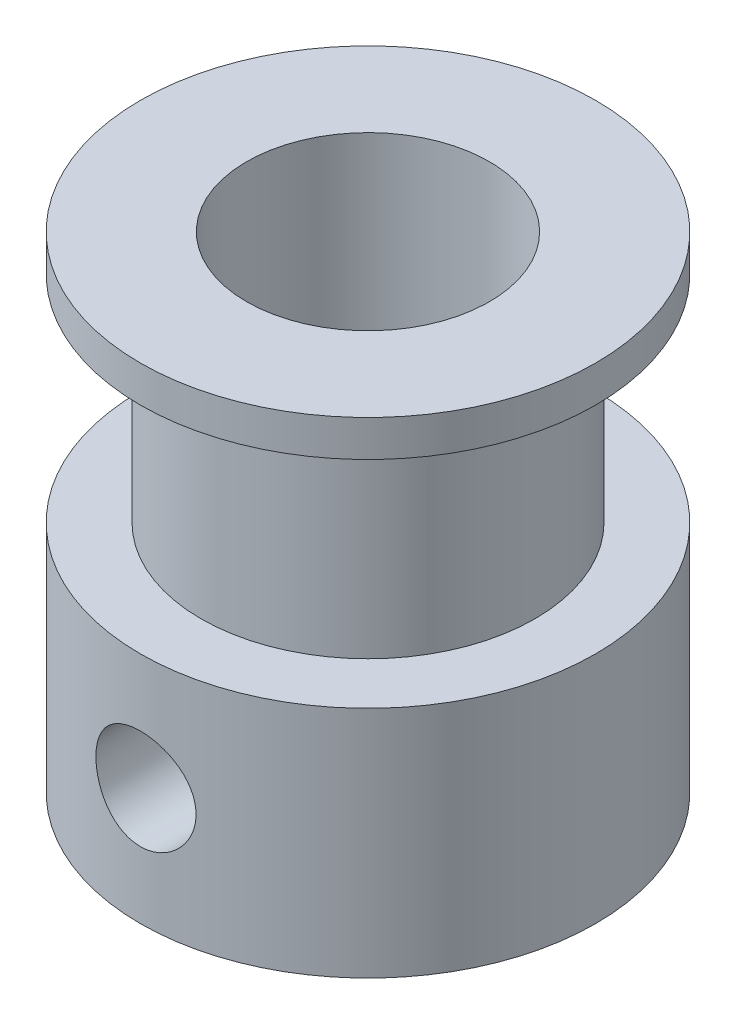
ISO-10303-21;
HEADER;
FILE_DESCRIPTION(('STEP AP214'),'2;1');
FILE_NAME('part.step','',(''),(''),'','','');
FILE_SCHEMA(('AUTOMOTIVE_DESIGN { 1 0 10303 214 1 1 1 1 }'));
ENDSEC;
DATA;
#1=APPLICATION_CONTEXT('core data for automotive mechanical design processes');
#2=APPLICATION_PROTOCOL_DEFINITION('international standard','automotive_design',2000,#1);
#3=PRODUCT_CONTEXT('',#1,'mechanical');
#4=PRODUCT('Part','Part','',(#3));
#5=PRODUCT_RELATED_PRODUCT_CATEGORY('part','',(#4));
#6=PRODUCT_DEFINITION_FORMATION('','',#4);
#7=PRODUCT_DEFINITION_CONTEXT('part definition',#1,'design');
#8=PRODUCT_DEFINITION('design','',#6,#7);
#9=PRODUCT_DEFINITION_SHAPE('','',#8);
#10=(LENGTH_UNIT() NAMED_UNIT(*) SI_UNIT(.MILLI.,.METRE.));
#11=(NAMED_UNIT(*) PLANE_ANGLE_UNIT() SI_UNIT($,.RADIAN.));
#12=(NAMED_UNIT(*) SI_UNIT($,.STERADIAN.) SOLID_ANGLE_UNIT());
#13=UNCERTAINTY_MEASURE_WITH_UNIT(LENGTH_MEASURE(1.E-05),#10,'distance_accuracy_value','');
#14=(GEOMETRIC_REPRESENTATION_CONTEXT(3) GLOBAL_UNCERTAINTY_ASSIGNED_CONTEXT((#13)) GLOBAL_UNIT_ASSIGNED_CONTEXT((#10,
#11,#12)) REPRESENTATION_CONTEXT('',''));
#15=CARTESIAN_POINT('',(0.,0.,0.));
#16=DIRECTION('',(0.,0.,1.));
#17=DIRECTION('',(1.,0.,0.));
#18=AXIS2_PLACEMENT_3D('',#15,#16,#17);
#19=CARTESIAN_POINT('',(0.,7.7,0.));
#20=DIRECTION('',(0.,1.,0.));
#21=DIRECTION('',(0.,0.,1.));
#22=AXIS2_PLACEMENT_3D('',#19,#20,#21);
#23=PLANE('',#22);
#24=CARTESIAN_POINT('',(0.,7.7,0.));
#25=DIRECTION('',(0.,1.,0.));
#26=DIRECTION('',(0.,0.,1.));
#27=AXIS2_PLACEMENT_3D('',#24,#25,#26);
#28=CIRCLE('',#27,7.5);
#29=CARTESIAN_POINT('',(0.,7.7,7.5));
#30=VERTEX_POINT('',#29);
#31=EDGE_CURVE('E10',#30,#30,#28,.T.);
#32=ORIENTED_EDGE('',*,*,#31,.T.);
#33=EDGE_LOOP('',(#32));
#34=FACE_BOUND('',#33,.T.);
#35=CARTESIAN_POINT('',(0.,7.7,0.));
#36=DIRECTION('',(0.,1.,0.));
#37=DIRECTION('',(0.,0.,1.));
#38=AXIS2_PLACEMENT_3D('',#35,#36,#37);
#39=CIRCLE('',#38,5.5);
#40=CARTESIAN_POINT('',(0.,7.7,5.5));
#41=VERTEX_POINT('',#40);
#42=EDGE_CURVE('E47',#41,#41,#39,.T.);
#43=ORIENTED_EDGE('',*,*,#42,.F.);
#44=EDGE_LOOP('',(#43));
#45=FACE_BOUND('',#44,.T.);
#46=ADVANCED_FACE('F34',(#34,#45),#23,.T.);
#47=CARTESIAN_POINT('',(0.,7.7,0.));
#48=DIRECTION('',(0.,-1.,0.));
#49=DIRECTION('',(0.,0.,-1.));
#50=AXIS2_PLACEMENT_3D('',#47,#48,#49);
#51=CYLINDRICAL_SURFACE('',#50,7.5);
#52=CARTESIAN_POINT('',(-7.31624903895431,3.85,-1.65000000000002));
#53=CARTESIAN_POINT('',(-7.31625088755515,3.94146973086409,-1.6499968723868));
#54=CARTESIAN_POINT('',(-7.31798309325128,4.03297693288286,-1.64236802798418));
#55=CARTESIAN_POINT('',(-7.32471183232318,4.21338806456882,-1.61208819446861));
#56=CARTESIAN_POINT('',(-7.32971070790264,4.30229007849127,-1.58942642656671));
#57=CARTESIAN_POINT('',(-7.34237985840046,4.47485502908709,-1.52982964328278));
#58=CARTESIAN_POINT('',(-7.35004718160979,4.55852363456255,-1.49291039391804));
#59=CARTESIAN_POINT('',(-7.36718575613813,4.7184815468929,-1.40589188591686));
#60=CARTESIAN_POINT('',(-7.37665697473834,4.79477098755221,-1.35579286632699));
#61=CARTESIAN_POINT('',(-7.3965170031272,4.93910974076173,-1.24292433856891));
#62=CARTESIAN_POINT('',(-7.40691766647597,5.00701458900787,-1.17997213988136));
#63=CARTESIAN_POINT('',(-7.42736095401493,5.13139107633494,-1.0435785816799));
#64=CARTESIAN_POINT('',(-7.4374035501214,5.18786182024078,-0.970136401673276));
#65=CARTESIAN_POINT('',(-7.45612834127545,5.28833929650793,-0.813878252361385));
#66=CARTESIAN_POINT('',(-7.46479491885843,5.33220696771727,-0.730970831126916));
#67=CARTESIAN_POINT('',(-7.47965723905511,5.40533320427458,-0.558738323735998));
#68=CARTESIAN_POINT('',(-7.48585326220645,5.4345934284299,-0.469413967598791));
#69=CARTESIAN_POINT('',(-7.49499258405706,5.4772194994386,-0.288385428255521));
#70=CARTESIAN_POINT('',(-7.49798587273974,5.49082987669094,-0.19674139004883));
#71=CARTESIAN_POINT('',(-7.50055570151691,5.50253456626563,-0.0124251616130323));
#72=CARTESIAN_POINT('',(-7.50013263686835,5.50063067352012,0.0802469084384781));
#73=CARTESIAN_POINT('',(-7.495955593825,5.48154274970476,0.262302467715047));
#74=CARTESIAN_POINT('',(-7.49225907708335,5.46462230565467,0.351715105755815));
#75=CARTESIAN_POINT('',(-7.48201600117218,5.41640176183781,0.526399853776861));
#76=CARTESIAN_POINT('',(-7.47546931215518,5.38510100693256,0.611671774918564));
#77=CARTESIAN_POINT('',(-7.4601692539791,5.30877597185231,0.776384814979645));
#78=CARTESIAN_POINT('',(-7.4513999396354,5.26365201347084,0.855778203030041));
#79=CARTESIAN_POINT('',(-7.43261578068531,5.16103585107844,1.0059618544021));
#80=CARTESIAN_POINT('',(-7.42260076463453,5.10354194381027,1.07675093086625));
#81=CARTESIAN_POINT('',(-7.40217730546681,4.9763837195204,1.20928438119746));
#82=CARTESIAN_POINT('',(-7.39176501831048,4.90648871816167,1.2708070306733));
#83=CARTESIAN_POINT('',(-7.37191784161863,4.75726574312354,1.38129938042402));
#84=CARTESIAN_POINT('',(-7.36248297921061,4.67793750776478,1.43026873234954));
#85=CARTESIAN_POINT('',(-7.34564860357408,4.51173851513502,1.51436459204096));
#86=CARTESIAN_POINT('',(-7.33825533607679,4.42484565931797,1.54944876044601));
#87=CARTESIAN_POINT('',(-7.32642749366314,4.24619629545267,1.60445002092191));
#88=CARTESIAN_POINT('',(-7.32199244335324,4.1544405714401,1.62436955006421));
#89=CARTESIAN_POINT('',(-7.31668025811922,3.97069723278599,1.64813125819885));
#90=CARTESIAN_POINT('',(-7.3157316460625,3.87875341120337,1.65229647649245));
#91=CARTESIAN_POINT('',(-7.31730686199935,3.69548511979447,1.64530629720021));
#92=CARTESIAN_POINT('',(-7.31983044843577,3.60416060732768,1.63415196537919));
#93=CARTESIAN_POINT('',(-7.32799818106293,3.42585095587481,1.59711971164377));
#94=CARTESIAN_POINT('',(-7.33360451240971,3.33882689194342,1.57142010132682));
#95=CARTESIAN_POINT('',(-7.34727186080226,3.17032002019244,1.50622005364928));
#96=CARTESIAN_POINT('',(-7.35533311504714,3.08883774876201,1.46671828264447));
#97=CARTESIAN_POINT('',(-7.3731587965039,2.93233060588287,1.37432488547162));
#98=CARTESIAN_POINT('',(-7.382947772276,2.85742593290676,1.32123448604816));
#99=CARTESIAN_POINT('',(-7.4030613604032,2.71747028808809,1.20343062618996));
#100=CARTESIAN_POINT('',(-7.41338603997543,2.65242055682212,1.13871570465473));
#101=CARTESIAN_POINT('',(-7.43364357465481,2.53276535480176,0.998037209735731));
#102=CARTESIAN_POINT('',(-7.44356535241184,2.4783802494884,0.921884336180632));
#103=CARTESIAN_POINT('',(-7.46169442992805,2.38317489882865,0.761336036824583));
#104=CARTESIAN_POINT('',(-7.46990181024338,2.34235401607305,0.676940998580206));
#105=CARTESIAN_POINT('',(-7.48363068143194,2.27574171059229,0.502832892211417));
#106=CARTESIAN_POINT('',(-7.48916925974756,2.2498544564071,0.413157897094201));
#107=CARTESIAN_POINT('',(-7.49701039926598,2.21354535667227,0.230596117157405));
#108=CARTESIAN_POINT('',(-7.49931343668317,2.20312123521036,0.137709807049009));
#109=CARTESIAN_POINT('',(-7.5004096608408,2.19813763024745,-0.0465467976169041));
#110=CARTESIAN_POINT('',(-7.49927560514944,2.20324928652386,-0.137907919239389));
#111=CARTESIAN_POINT('',(-7.49378116111434,2.22845586812367,-0.318434938549236));
#112=CARTESIAN_POINT('',(-7.48942083208781,2.24855051797476,-0.407600876565377));
#113=CARTESIAN_POINT('',(-7.47796938667334,2.30299430459218,-0.580948603319191));
#114=CARTESIAN_POINT('',(-7.47088730695872,2.33729629955119,-0.665145833031318));
#115=CARTESIAN_POINT('',(-7.45474818907577,2.41913529507116,-0.826633320628113));
#116=CARTESIAN_POINT('',(-7.44569095681539,2.46667359644966,-0.90392289866643));
#117=CARTESIAN_POINT('',(-7.42637227436533,2.57470542656565,-1.05100357132855));
#118=CARTESIAN_POINT('',(-7.41609106168948,2.6354299159513,-1.1206224429641));
#119=CARTESIAN_POINT('',(-7.39558892619984,2.76764517036168,-1.24879435055275));
#120=CARTESIAN_POINT('',(-7.38536801854032,2.83913853101667,-1.30734471095976));
#121=CARTESIAN_POINT('',(-7.36598909951959,2.9920282321614,-1.41248320884195));
#122=CARTESIAN_POINT('',(-7.35684738344025,3.0735457294591,-1.45889834183912));
#123=CARTESIAN_POINT('',(-7.34086729136659,3.24340812301069,-1.53729647396118));
#124=CARTESIAN_POINT('',(-7.33402697741116,3.33174719748978,-1.56929162359244));
#125=CARTESIAN_POINT('',(-7.32468149984519,3.49180640143421,-1.61226511938891));
#126=CARTESIAN_POINT('',(-7.3215404178438,3.56266180531771,-1.62638842605615));
#127=CARTESIAN_POINT('',(-7.31732350955713,3.70567040573683,-1.64525686645989));
#128=CARTESIAN_POINT('',(-7.31624758026991,3.77782353736554,-1.6500024679209));
#129=CARTESIAN_POINT('',(-7.31624903895431,3.85,-1.65000000000002));
#130=B_SPLINE_CURVE_WITH_KNOTS('',3,(#52,#53,#54,#55,#56,#57,#58,#59,#60,#61,#62,#63,#64,#65,
#66,#67,#68,#69,#70,#71,#72,#73,#74,#75,#76,#77,#78,#79,#80,#81,#82,#83,#84,#85,#86,#87,#88,#89,
#90,#91,#92,#93,#94,#95,#96,#97,#98,#99,#100,#101,#102,#103,#104,#105,#106,#107,#108,#109,#110,
#111,#112,#113,#114,#115,#116,#117,#118,#119,#120,#121,#122,#123,#124,#125,#126,#127,#128,#129),
.UNSPECIFIED.,.T.,.F.,(4,2,2,2,2,2,2,2,2,2,2,2,2,2,2,2,2,2,2,2,2,2,2,2,2,2,2,2,2,2,2,2,2,2,2,2,
2,2,4),(0.,0.274144651661673,0.548486081142453,0.822525006744839,1.09655896234066,
1.37479941240961,1.65306163748477,1.93428561187474,2.21547764347729,2.49221362033069,
2.76891758051511,3.04085852905802,3.31281186792031,3.58677434219925,3.86077456340393,
4.14054172785271,4.42031665489643,4.70093823069211,4.98151469896661,5.25630579423046,
5.5310777735383,5.8025520804998,6.07405262612899,6.34977751987123,6.62553709409573,
6.90650280685807,7.18745531462717,7.46658425375132,7.74567210572694,8.01889368789618,
8.29211024682832,8.56442740979039,8.83677134457515,9.11433803885878,9.39197174265346,
9.67337079196286,9.95453228463008,10.1708637200099,10.3871843653226),.UNSPECIFIED.);
#131=CARTESIAN_POINT('',(-7.31624903895431,3.85,-1.65000000000002));
#132=VERTEX_POINT('',#131);
#133=EDGE_CURVE('E93',#132,#132,#130,.T.);
#134=ORIENTED_EDGE('',*,*,#133,.T.);
#135=EDGE_LOOP('',(#134));
#136=FACE_BOUND('',#135,.T.);
#137=CARTESIAN_POINT('',(-1.65,3.85,7.31624903895432));
#138=CARTESIAN_POINT('',(-1.64999687238678,3.94146973086409,7.31625088755516));
#139=CARTESIAN_POINT('',(-1.64236802798416,4.03297693288286,7.31798309325129));
#140=CARTESIAN_POINT('',(-1.61208819446858,4.21338806456882,7.32471183232318));
#141=CARTESIAN_POINT('',(-1.58942642656669,4.30229007849127,7.32971070790265));
#142=CARTESIAN_POINT('',(-1.52982964328276,4.47485502908709,7.34237985840046));
#143=CARTESIAN_POINT('',(-1.49291039391801,4.55852363456255,7.3500471816098));
#144=CARTESIAN_POINT('',(-1.40589188591683,4.7184815468929,7.36718575613814));
#145=CARTESIAN_POINT('',(-1.35579286632696,4.79477098755221,7.37665697473834));
#146=CARTESIAN_POINT('',(-1.24292433856889,4.93910974076172,7.39651700312721));
#147=CARTESIAN_POINT('',(-1.17997213988133,5.00701458900787,7.40691766647597));
#148=CARTESIAN_POINT('',(-1.04357858167987,5.13139107633494,7.42736095401494));
#149=CARTESIAN_POINT('',(-0.97013640167325,5.18786182024078,7.43740355012141));
#150=CARTESIAN_POINT('',(-0.81387825236136,5.28833929650793,7.45612834127545));
#151=CARTESIAN_POINT('',(-0.73097083112689,5.33220696771727,7.46479491885843));
#152=CARTESIAN_POINT('',(-0.558738323735973,5.40533320427458,7.47965723905511));
#153=CARTESIAN_POINT('',(-0.469413967598766,5.4345934284299,7.48585326220645));
#154=CARTESIAN_POINT('',(-0.288385428255495,5.4772194994386,7.49499258405706));
#155=CARTESIAN_POINT('',(-0.196741390048804,5.49082987669094,7.49798587273975));
#156=CARTESIAN_POINT('',(-0.012425161613006,5.50253456626563,7.50055570151691));
#157=CARTESIAN_POINT('',(0.0802469084385042,5.50063067352012,7.50013263686835));
#158=CARTESIAN_POINT('',(0.262302467715074,5.48154274970476,7.495955593825));
#159=CARTESIAN_POINT('',(0.351715105755841,5.46462230565467,7.49225907708335));
#160=CARTESIAN_POINT('',(0.526399853776888,5.41640176183781,7.48201600117218));
#161=CARTESIAN_POINT('',(0.61167177491859,5.38510100693256,7.47546931215517));
#162=CARTESIAN_POINT('',(0.776384814979671,5.30877597185231,7.4601692539791));
#163=CARTESIAN_POINT('',(0.855778203030067,5.26365201347084,7.4513999396354));
#164=CARTESIAN_POINT('',(1.00596185440213,5.16103585107844,7.43261578068531));
#165=CARTESIAN_POINT('',(1.07675093086628,5.10354194381027,7.42260076463452));
#166=CARTESIAN_POINT('',(1.20928438119749,4.9763837195204,7.4021773054668));
#167=CARTESIAN_POINT('',(1.27080703067333,4.90648871816167,7.39176501831048));
#168=CARTESIAN_POINT('',(1.38129938042404,4.75726574312354,7.37191784161863));
#169=CARTESIAN_POINT('',(1.43026873234956,4.67793750776478,7.36248297921061));
#170=CARTESIAN_POINT('',(1.51436459204098,4.51173851513502,7.34564860357408));
#171=CARTESIAN_POINT('',(1.54944876044604,4.42484565931797,7.33825533607679));
#172=CARTESIAN_POINT('',(1.60445002092193,4.24619629545267,7.32642749366313));
#173=CARTESIAN_POINT('',(1.62436955006424,4.1544405714401,7.32199244335324));
#174=CARTESIAN_POINT('',(1.64813125819888,3.97069723278599,7.31668025811921));
#175=CARTESIAN_POINT('',(1.65229647649247,3.87875341120337,7.31573164606249));
#176=CARTESIAN_POINT('',(1.64530629720023,3.69548511979447,7.31730686199934));
#177=CARTESIAN_POINT('',(1.63415196537921,3.60416060732768,7.31983044843577));
#178=CARTESIAN_POINT('',(1.59711971164379,3.4258509558748,7.32799818106292));
#179=CARTESIAN_POINT('',(1.57142010132685,3.33882689194341,7.33360451240971));
#180=CARTESIAN_POINT('',(1.50622005364931,3.17032002019244,7.34727186080226));
#181=CARTESIAN_POINT('',(1.4667182826445,3.08883774876201,7.35533311504714));
#182=CARTESIAN_POINT('',(1.37432488547164,2.93233060588287,7.37315879650389));
#183=CARTESIAN_POINT('',(1.32123448604819,2.85742593290676,7.38294777227599));
#184=CARTESIAN_POINT('',(1.20343062618998,2.71747028808809,7.4030613604032));
#185=CARTESIAN_POINT('',(1.13871570465475,2.65242055682212,7.41338603997542));
#186=CARTESIAN_POINT('',(0.998037209735757,2.53276535480176,7.43364357465481));
#187=CARTESIAN_POINT('',(0.921884336180657,2.4783802494884,7.44356535241183));
#188=CARTESIAN_POINT('',(0.761336036824609,2.38317489882865,7.46169442992805));
#189=CARTESIAN_POINT('',(0.676940998580232,2.34235401607305,7.46990181024338));
#190=CARTESIAN_POINT('',(0.502832892211442,2.27574171059229,7.48363068143194));
#191=CARTESIAN_POINT('',(0.413157897094227,2.2498544564071,7.48916925974756));
#192=CARTESIAN_POINT('',(0.230596117157431,2.21354535667227,7.49701039926598));
#193=CARTESIAN_POINT('',(0.137709807049034,2.20312123521036,7.49931343668317));
#194=CARTESIAN_POINT('',(-0.0465467976168785,2.19813763024745,7.5004096608408));
#195=CARTESIAN_POINT('',(-0.137907919239363,2.20324928652386,7.49927560514944));
#196=CARTESIAN_POINT('',(-0.31843493854921,2.22845586812367,7.49378116111434));
#197=CARTESIAN_POINT('',(-0.407600876565352,2.24855051797476,7.48942083208781));
#198=CARTESIAN_POINT('',(-0.580948603319166,2.30299430459218,7.47796938667334));
#199=CARTESIAN_POINT('',(-0.665145833031293,2.33729629955119,7.47088730695872));
#200=CARTESIAN_POINT('',(-0.826633320628087,2.41913529507116,7.45474818907578));
#201=CARTESIAN_POINT('',(-0.903922898666404,2.46667359644966,7.44569095681539));
#202=CARTESIAN_POINT('',(-1.05100357132852,2.57470542656565,7.42637227436533));
#203=CARTESIAN_POINT('',(-1.12062244296407,2.6354299159513,7.41609106168948));
#204=CARTESIAN_POINT('',(-1.24879435055272,2.76764517036168,7.39558892619985));
#205=CARTESIAN_POINT('',(-1.30734471095974,2.83913853101667,7.38536801854032));
#206=CARTESIAN_POINT('',(-1.41248320884192,2.9920282321614,7.36598909951959));
#207=CARTESIAN_POINT('',(-1.4588983418391,3.0735457294591,7.35684738344025));
#208=CARTESIAN_POINT('',(-1.53729647396116,3.24340812301069,7.34086729136659));
#209=CARTESIAN_POINT('',(-1.56929162359241,3.33174719748978,7.33402697741117));
#210=CARTESIAN_POINT('',(-1.61226511938889,3.49180640143421,7.3246814998452));
#211=CARTESIAN_POINT('',(-1.62638842605612,3.56266180531771,7.32154041784381));
#212=CARTESIAN_POINT('',(-1.64525686645986,3.70567040573683,7.31732350955714));
#213=CARTESIAN_POINT('',(-1.65000246792088,3.77782353736554,7.31624758026992));
#214=CARTESIAN_POINT('',(-1.65,3.85,7.31624903895432));
#215=B_SPLINE_CURVE_WITH_KNOTS('',3,(#137,#138,#139,#140,#141,#142,#143,#144,#145,#146,#147,
#148,#149,#150,#151,#152,#153,#154,#155,#156,#157,#158,#159,#160,#161,#162,#163,#164,#165,#166,
#167,#168,#169,#170,#171,#172,#173,#174,#175,#176,#177,#178,#179,#180,#181,#182,#183,#184,#185,
#186,#187,#188,#189,#190,#191,#192,#193,#194,#195,#196,#197,#198,#199,#200,#201,#202,#203,#204,
#205,#206,#207,#208,#209,#210,#211,#212,#213,#214),.UNSPECIFIED.,.T.,.F.,(4,2,2,2,2,2,2,2,2,2,2,
2,2,2,2,2,2,2,2,2,2,2,2,2,2,2,2,2,2,2,2,2,2,2,2,2,2,2,4),(0.,0.274144651661673,
0.548486081142454,0.822525006744839,1.09655896234066,1.37479941240961,1.65306163748477,
1.93428561187474,2.21547764347729,2.49221362033069,2.76891758051511,3.04085852905802,
3.31281186792031,3.58677434219925,3.86077456340393,4.14054172785271,4.42031665489642,
4.70093823069211,4.98151469896661,5.25630579423046,5.5310777735383,5.8025520804998,
6.07405262612899,6.34977751987123,6.62553709409573,6.90650280685807,7.18745531462717,
7.46658425375132,7.74567210572694,8.01889368789618,8.29211024682833,8.56442740979039,
8.83677134457515,9.11433803885878,9.39197174265346,9.67337079196286,9.95453228463008,
10.1708637200099,10.3871843653226),.UNSPECIFIED.);
#216=CARTESIAN_POINT('',(-1.65,3.85,7.31624903895432));
#217=VERTEX_POINT('',#216);
#218=EDGE_CURVE('E72',#217,#217,#215,.T.);
#219=ORIENTED_EDGE('',*,*,#218,.T.);
#220=EDGE_LOOP('',(#219));
#221=FACE_BOUND('',#220,.T.);
#222=ORIENTED_EDGE('',*,*,#31,.F.);
#223=EDGE_LOOP('',(#222));
#224=FACE_BOUND('',#223,.T.);
#225=CARTESIAN_POINT('',(0.,0.,0.));
#226=DIRECTION('',(0.,1.,0.));
#227=DIRECTION('',(0.,0.,1.));
#228=AXIS2_PLACEMENT_3D('',#225,#226,#227);
#229=CIRCLE('',#228,7.5);
#230=CARTESIAN_POINT('',(0.,0.,7.5));
#231=VERTEX_POINT('',#230);
#232=EDGE_CURVE('E38',#231,#231,#229,.T.);
#233=ORIENTED_EDGE('',*,*,#232,.T.);
#234=EDGE_LOOP('',(#233));
#235=FACE_BOUND('',#234,.T.);
#236=ADVANCED_FACE('F36',(#136,#221,#224,#235),#51,.T.);
#237=CARTESIAN_POINT('',(0.,0.,0.));
#238=DIRECTION('',(0.,1.,0.));
#239=DIRECTION('',(0.,0.,1.));
#240=AXIS2_PLACEMENT_3D('',#237,#238,#239);
#241=PLANE('',#240);
#242=CARTESIAN_POINT('',(0.,0.,0.));
#243=DIRECTION('',(0.,1.,0.));
#244=DIRECTION('',(0.,0.,1.));
#245=AXIS2_PLACEMENT_3D('',#242,#243,#244);
#246=CIRCLE('',#245,4.);
#247=CARTESIAN_POINT('',(0.,0.,4.));
#248=VERTEX_POINT('',#247);
#249=EDGE_CURVE('E56',#248,#248,#246,.T.);
#250=ORIENTED_EDGE('',*,*,#249,.T.);
#251=EDGE_LOOP('',(#250));
#252=FACE_BOUND('',#251,.T.);
#253=ORIENTED_EDGE('',*,*,#232,.F.);
#254=EDGE_LOOP('',(#253));
#255=FACE_BOUND('',#254,.T.);
#256=ADVANCED_FACE('F138',(#252,#255),#241,.F.);
#257=CARTESIAN_POINT('',(0.,14.8,0.));
#258=DIRECTION('',(0.,-1.,0.));
#259=DIRECTION('',(0.,0.,-1.));
#260=AXIS2_PLACEMENT_3D('',#257,#258,#259);
#261=CYLINDRICAL_SURFACE('',#260,5.5);
#262=CARTESIAN_POINT('',(0.,14.8,0.));
#263=DIRECTION('',(0.,1.,0.));
#264=DIRECTION('',(0.,0.,1.));
#265=AXIS2_PLACEMENT_3D('',#262,#263,#264);
#266=CIRCLE('',#265,5.5);
#267=CARTESIAN_POINT('',(0.,14.8,5.5));
#268=VERTEX_POINT('',#267);
#269=EDGE_CURVE('E45',#268,#268,#266,.T.);
#270=ORIENTED_EDGE('',*,*,#269,.F.);
#271=EDGE_LOOP('',(#270));
#272=FACE_BOUND('',#271,.T.);
#273=ORIENTED_EDGE('',*,*,#42,.T.);
#274=EDGE_LOOP('',(#273));
#275=FACE_BOUND('',#274,.T.);
#276=ADVANCED_FACE('F132',(#272,#275),#261,.T.);
#277=CARTESIAN_POINT('',(0.,14.8,0.));
#278=DIRECTION('',(0.,1.,0.));
#279=DIRECTION('',(0.,0.,1.));
#280=AXIS2_PLACEMENT_3D('',#277,#278,#279);
#281=PLANE('',#280);
#282=CARTESIAN_POINT('',(0.,14.8,0.));
#283=DIRECTION('',(0.,1.,0.));
#284=DIRECTION('',(0.,0.,1.));
#285=AXIS2_PLACEMENT_3D('',#282,#283,#284);
#286=CIRCLE('',#285,7.5);
#287=CARTESIAN_POINT('',(0.,14.8,7.5));
#288=VERTEX_POINT('',#287);
#289=EDGE_CURVE('E53',#288,#288,#286,.T.);
#290=ORIENTED_EDGE('',*,*,#289,.F.);
#291=EDGE_LOOP('',(#290));
#292=FACE_BOUND('',#291,.T.);
#293=ORIENTED_EDGE('',*,*,#269,.T.);
#294=EDGE_LOOP('',(#293));
#295=FACE_BOUND('',#294,.T.);
#296=ADVANCED_FACE('F126',(#292,#295),#281,.F.);
#297=CARTESIAN_POINT('',(0.,16.,0.));
#298=DIRECTION('',(0.,-1.,0.));
#299=DIRECTION('',(0.,0.,-1.));
#300=AXIS2_PLACEMENT_3D('',#297,#298,#299);
#301=CYLINDRICAL_SURFACE('',#300,7.5);
#302=CARTESIAN_POINT('',(0.,16.,0.));
#303=DIRECTION('',(0.,1.,0.));
#304=DIRECTION('',(0.,0.,1.));
#305=AXIS2_PLACEMENT_3D('',#302,#303,#304);
#306=CIRCLE('',#305,7.5);
#307=CARTESIAN_POINT('',(0.,16.,7.5));
#308=VERTEX_POINT('',#307);
#309=EDGE_CURVE('E50',#308,#308,#306,.T.);
#310=ORIENTED_EDGE('',*,*,#309,.F.);
#311=EDGE_LOOP('',(#310));
#312=FACE_BOUND('',#311,.T.);
#313=ORIENTED_EDGE('',*,*,#289,.T.);
#314=EDGE_LOOP('',(#313));
#315=FACE_BOUND('',#314,.T.);
#316=ADVANCED_FACE('F121',(#312,#315),#301,.T.);
#317=CARTESIAN_POINT('',(0.,16.,0.));
#318=DIRECTION('',(0.,1.,0.));
#319=DIRECTION('',(0.,0.,1.));
#320=AXIS2_PLACEMENT_3D('',#317,#318,#319);
#321=PLANE('',#320);
#322=CARTESIAN_POINT('',(0.,16.,0.));
#323=DIRECTION('',(0.,1.,0.));
#324=DIRECTION('',(0.,0.,1.));
#325=AXIS2_PLACEMENT_3D('',#322,#323,#324);
#326=CIRCLE('',#325,4.);
#327=CARTESIAN_POINT('',(0.,16.,4.));
#328=VERTEX_POINT('',#327);
#329=EDGE_CURVE('E59',#328,#328,#326,.T.);
#330=ORIENTED_EDGE('',*,*,#329,.F.);
#331=EDGE_LOOP('',(#330));
#332=FACE_BOUND('',#331,.T.);
#333=ORIENTED_EDGE('',*,*,#309,.T.);
#334=EDGE_LOOP('',(#333));
#335=FACE_BOUND('',#334,.T.);
#336=ADVANCED_FACE('F114',(#332,#335),#321,.T.);
#337=CARTESIAN_POINT('',(0.,0.,0.));
#338=DIRECTION('',(0.,1.,0.));
#339=DIRECTION('',(0.,0.,1.));
#340=AXIS2_PLACEMENT_3D('',#337,#338,#339);
#341=CYLINDRICAL_SURFACE('',#340,4.);
#342=CARTESIAN_POINT('',(-3.6438304022004,3.85,-1.65000000000001));
#343=CARTESIAN_POINT('',(-3.64383945275152,3.76190351977432,-1.64999056813103));
#344=CARTESIAN_POINT('',(-3.64707173267573,3.67365956802641,-1.64289989177359));
#345=CARTESIAN_POINT('',(-3.65959209124687,3.49971293892112,-1.61480845546374));
#346=CARTESIAN_POINT('',(-3.66889676295874,3.4140178994024,-1.59376957896341));
#347=CARTESIAN_POINT('',(-3.69231325052125,3.24799706186937,-1.53873536249639));
#348=CARTESIAN_POINT('',(-3.70640571161011,3.1676511797814,-1.50479212400175));
#349=CARTESIAN_POINT('',(-3.73778230052356,3.01381823316578,-1.42506535594208));
#350=CARTESIAN_POINT('',(-3.75506562873472,2.94032945721597,-1.37928479159597));
#351=CARTESIAN_POINT('',(-3.7920553041855,2.7977713121535,-1.27419856290373));
#352=CARTESIAN_POINT('',(-3.81184277704779,2.72917074421979,-1.21428518241361));
#353=CARTESIAN_POINT('',(-3.85094363418237,2.60264522809124,-1.08391072165484));
#354=CARTESIAN_POINT('',(-3.87025683535296,2.54472434852778,-1.01344563996366));
#355=CARTESIAN_POINT('',(-3.90721575035942,2.43882862869814,-0.860301943593394));
#356=CARTESIAN_POINT('',(-3.92475616703247,2.39137906729384,-0.777232390113603));
#357=CARTESIAN_POINT('',(-3.95520283117798,2.3113298546783,-0.603436361875869));
#358=CARTESIAN_POINT('',(-3.96811109652272,2.27872373565344,-0.512713242513057));
#359=CARTESIAN_POINT('',(-3.98726403378776,2.23097929334377,-0.331105172304411));
#360=CARTESIAN_POINT('',(-3.99381564337609,2.21503315207677,-0.240465625184505));
#361=CARTESIAN_POINT('',(-4.0006306156112,2.19845334814483,-0.0575763551498782));
#362=CARTESIAN_POINT('',(-4.00089647540932,2.19781360467799,0.0346727137709422));
#363=CARTESIAN_POINT('',(-3.99529224160632,2.2114364961366,0.212297380895972));
#364=CARTESIAN_POINT('',(-3.98978733384659,2.2248121837171,0.297754665400384));
#365=CARTESIAN_POINT('',(-3.97375926025945,2.26456881744776,0.465085845235266));
#366=CARTESIAN_POINT('',(-3.96323572489496,2.29095072129068,0.546959476205479));
#367=CARTESIAN_POINT('',(-3.93798907731603,2.35628766172018,0.706295606817216));
#368=CARTESIAN_POINT('',(-3.92320447216363,2.39542798992487,0.783671979762457));
#369=CARTESIAN_POINT('',(-3.89088763760773,2.4849912791866,0.930960489992453));
#370=CARTESIAN_POINT('',(-3.87335444442337,2.53541820050331,1.00086999453931));
#371=CARTESIAN_POINT('',(-3.83587133640027,2.65018823902864,1.13638530947039));
#372=CARTESIAN_POINT('',(-3.8158381454309,2.71525341089872,1.20135746318644));
#373=CARTESIAN_POINT('',(-3.77653142784556,2.85540966632157,1.31973838423492));
#374=CARTESIAN_POINT('',(-3.75725818494773,2.9305044492633,1.37314286572201));
#375=CARTESIAN_POINT('',(-3.7210660715691,3.09159840354731,1.46845339844827));
#376=CARTESIAN_POINT('',(-3.70424107982558,3.17786757169265,1.50994179309275));
#377=CARTESIAN_POINT('',(-3.67596385006486,3.3570466714059,1.57754508127094));
#378=CARTESIAN_POINT('',(-3.66450786071418,3.44995191387382,1.6036707120612));
#379=CARTESIAN_POINT('',(-3.64919091711419,3.63342289518498,1.6382132035594));
#380=CARTESIAN_POINT('',(-3.64489111171832,3.72375830118286,1.6476556945468));
#381=CARTESIAN_POINT('',(-3.64311980380968,3.9048056296986,1.65157101672825));
#382=CARTESIAN_POINT('',(-3.6456460160745,3.99551741605928,1.646048857804));
#383=CARTESIAN_POINT('',(-3.65678944366162,4.16880100904947,1.62112710501825));
#384=CARTESIAN_POINT('',(-3.66501803861665,4.25152817967461,1.60261202118541));
#385=CARTESIAN_POINT('',(-3.68614612916708,4.41263706437997,1.55339580262014));
#386=CARTESIAN_POINT('',(-3.69904670212357,4.49101777135166,1.52269185697122));
#387=CARTESIAN_POINT('',(-3.72872477858183,4.64487900569564,1.44853902204984));
#388=CARTESIAN_POINT('',(-3.74564214050946,4.72010019477924,1.40460979308263));
#389=CARTESIAN_POINT('',(-3.78124523189864,4.86246016942973,1.3057345540945));
#390=CARTESIAN_POINT('',(-3.79993171387674,4.92959548773512,1.25078384473682));
#391=CARTESIAN_POINT('',(-3.83876011670653,5.05942962644671,1.12627542162097));
#392=CARTESIAN_POINT('',(-3.85889967217623,5.12135173704872,1.05590387126703));
#393=CARTESIAN_POINT('',(-3.89698114804694,5.23264285566207,0.905297980080091));
#394=CARTESIAN_POINT('',(-3.91492292631237,5.2820110520032,0.825063002026891));
#395=CARTESIAN_POINT('',(-3.94668767391886,5.36670413420679,0.656516816883255));
#396=CARTESIAN_POINT('',(-3.96050313975064,5.40200347500273,0.568191273870479));
#397=CARTESIAN_POINT('',(-3.98237104121022,5.45699165685874,0.386140833605164));
#398=CARTESIAN_POINT('',(-3.9904268305481,5.47668958293894,0.292419112817548));
#399=CARTESIAN_POINT('',(-3.9994889299446,5.49878822892048,0.109187189544823));
#400=CARTESIAN_POINT('',(-4.00094173424749,5.50228482874194,0.0198303081186226));
#401=CARTESIAN_POINT('',(-3.99786220239438,5.49481456562972,-0.158161739195425));
#402=CARTESIAN_POINT('',(-3.99333087896147,5.48385015000455,-0.246797024648493));
#403=CARTESIAN_POINT('',(-3.979024148364,5.44855535786444,-0.417705375935889));
#404=CARTESIAN_POINT('',(-3.96943363922013,5.42469555788545,-0.500092371627864));
#405=CARTESIAN_POINT('',(-3.94605480923815,5.36479588512001,-0.659667355734173));
#406=CARTESIAN_POINT('',(-3.93226568297162,5.32875367521332,-0.736854343148757));
#407=CARTESIAN_POINT('',(-3.90105808483759,5.24369547331361,-0.887661133732631));
#408=CARTESIAN_POINT('',(-3.88350423911689,5.19416874322707,-0.960964214361162));
#409=CARTESIAN_POINT('',(-3.84685709666619,5.08429715321,-1.09852932170706));
#410=CARTESIAN_POINT('',(-3.82776324400832,5.02394837691919,-1.16278806031651));
#411=CARTESIAN_POINT('',(-3.78859741195737,4.88941247264534,-1.28487769945048));
#412=CARTESIAN_POINT('',(-3.76854475207571,4.81457224311506,-1.34199767947158));
#413=CARTESIAN_POINT('',(-3.73105419200533,4.65573402431894,-1.44296474677331));
#414=CARTESIAN_POINT('',(-3.71361773967119,4.57173100829041,-1.48680449811905));
#415=CARTESIAN_POINT('',(-3.68370387904712,4.39727155873011,-1.55944447766653));
#416=CARTESIAN_POINT('',(-3.67119480418033,4.3068608919089,-1.58834112875235));
#417=CARTESIAN_POINT('',(-3.65281837075146,4.12195285592164,-1.63017263567574));
#418=CARTESIAN_POINT('',(-3.64692873900431,4.02747030912313,-1.64316103312976));
#419=CARTESIAN_POINT('',(-3.64414054419779,3.90513668635736,-1.64931209329421));
#420=CARTESIAN_POINT('',(-3.64382756923722,3.87757556771498,-1.65000295232161));
#421=CARTESIAN_POINT('',(-3.6438304022004,3.85,-1.65000000000001));
#422=B_SPLINE_CURVE_WITH_KNOTS('',3,(#342,#343,#344,#345,#346,#347,#348,#349,#350,#351,#352,
#353,#354,#355,#356,#357,#358,#359,#360,#361,#362,#363,#364,#365,#366,#367,#368,#369,#370,#371,
#372,#373,#374,#375,#376,#377,#378,#379,#380,#381,#382,#383,#384,#385,#386,#387,#388,#389,#390,
#391,#392,#393,#394,#395,#396,#397,#398,#399,#400,#401,#402,#403,#404,#405,#406,#407,#408,#409,
#410,#411,#412,#413,#414,#415,#416,#417,#418,#419,#420,#421),.UNSPECIFIED.,.T.,.F.,(4,2,2,2,2,2,
2,2,2,2,2,2,2,2,2,2,2,2,2,2,2,2,2,2,2,2,2,2,2,2,2,2,2,2,2,2,2,2,2,4),(0.,0.264211724660744,
0.529148459018597,0.793026677872048,1.05683885985756,1.33523297260792,1.61373292676209,
1.90403076094908,2.19420198072699,2.4695381624427,2.74476495901024,3.00356896819766,
3.26239203686791,3.5251552692474,3.78801084539545,4.06907613148064,4.35024537535724,
4.64031806272423,4.9301877724111,5.20152035698263,5.47276211576042,5.72713321026166,
5.9815630002888,6.24665916965708,6.51186861189123,6.79815687284346,7.08446363898863,
7.3712879145617,7.6579450434915,7.92489841526079,8.19180661499935,8.44957452423759,
8.70739191275388,8.97680852354694,9.24632283025306,9.53374725602175,9.82133016535515,
10.1070334851925,10.3917725616094,10.4744749384332),.UNSPECIFIED.);
#423=CARTESIAN_POINT('',(-3.6438304022004,3.85,-1.65000000000001));
#424=VERTEX_POINT('',#423);
#425=EDGE_CURVE('E98',#424,#424,#422,.T.);
#426=ORIENTED_EDGE('',*,*,#425,.T.);
#427=EDGE_LOOP('',(#426));
#428=FACE_BOUND('',#427,.T.);
#429=CARTESIAN_POINT('',(0.,2.2,4.));
#430=CARTESIAN_POINT('',(0.0884596783632789,2.20000921720663,3.99999309817074));
#431=CARTESIAN_POINT('',(0.177062252057582,2.20715601434332,3.99703145792172));
#432=CARTESIAN_POINT('',(0.351759669836409,2.2354911419369,3.9854711320255));
#433=CARTESIAN_POINT('',(0.437847271996961,2.25671651102432,3.97685757767606));
#434=CARTESIAN_POINT('',(0.604702496902741,2.31229481220189,3.95491965529936));
#435=CARTESIAN_POINT('',(0.685486934491196,2.34660364335346,3.94161112398211));
#436=CARTESIAN_POINT('',(0.840076633223487,2.42719475784943,3.91158286286531));
#437=CARTESIAN_POINT('',(0.913884076117566,2.47347328117016,3.89486420463244));
#438=CARTESIAN_POINT('',(1.05618769598525,2.57910675464405,3.85876900012149));
#439=CARTESIAN_POINT('',(1.12429373957476,2.63895767024897,3.83930654387258));
#440=CARTESIAN_POINT('',(1.24983574384757,2.76898883965897,3.80029483347099));
#441=CARTESIAN_POINT('',(1.30726618926957,2.83917439921181,3.78074553976622));
#442=CARTESIAN_POINT('',(1.41254826809049,2.99196824887171,3.74272551686067));
#443=CARTESIAN_POINT('',(1.45980781790561,3.07501111530652,3.72435159658093));
#444=CARTESIAN_POINT('',(1.53951358199407,3.24873630929018,3.69212136090386));
#445=CARTESIAN_POINT('',(1.57196727712791,3.33941475136301,3.67826276509115));
#446=CARTESIAN_POINT('',(1.61953738222492,3.52134799700183,3.65756021871623));
#447=CARTESIAN_POINT('',(1.63540371417154,3.61237107214307,3.65041449103236));
#448=CARTESIAN_POINT('',(1.65168918120803,3.79604650736528,3.64307714795703));
#449=CARTESIAN_POINT('',(1.65211659474,3.8886979676293,3.64288180572738));
#450=CARTESIAN_POINT('',(1.6380778077983,4.06559888661872,3.64921138579605));
#451=CARTESIAN_POINT('',(1.62472398487459,4.14995815874916,3.6552343974104));
#452=CARTESIAN_POINT('',(1.58536484231198,4.31511028438117,3.67247532251837));
#453=CARTESIAN_POINT('',(1.55935715587185,4.3959024676033,3.68369420783859));
#454=CARTESIAN_POINT('',(1.49492412942489,4.55364510875862,3.71031458481431));
#455=CARTESIAN_POINT('',(1.45624866973017,4.63047873780833,3.72579923184191));
#456=CARTESIAN_POINT('',(1.36775445443624,4.77686023246004,3.75918616236907));
#457=CARTESIAN_POINT('',(1.31793135478159,4.84640524224915,3.77708938726885));
#458=CARTESIAN_POINT('',(1.20371911924869,4.98228640778782,3.81509742396095));
#459=CARTESIAN_POINT('',(1.13846630094389,5.04788195770326,3.8352618825369));
#460=CARTESIAN_POINT('',(0.997682554866215,5.16744467444138,3.87426910607353));
#461=CARTESIAN_POINT('',(0.922149319847433,5.22140922386084,3.8931115728953));
#462=CARTESIAN_POINT('',(0.760736369737324,5.31723477358504,3.92787932271737));
#463=CARTESIAN_POINT('',(0.674664094072236,5.35880028319418,3.94373050716791));
#464=CARTESIAN_POINT('',(0.495928253552976,5.42660302410888,3.97016319816605));
#465=CARTESIAN_POINT('',(0.403268287372385,5.45284855321117,3.98074755693754));
#466=CARTESIAN_POINT('',(0.220181304317673,5.48772950367822,3.99492450637935));
#467=CARTESIAN_POINT('',(0.129974172308222,5.49735917793594,3.99891121146315));
#468=CARTESIAN_POINT('',(-0.0508474401522223,5.5016920437633,4.00069746426785));
#469=CARTESIAN_POINT('',(-0.141461799500566,5.49639941310822,3.99849874371343));
#470=CARTESIAN_POINT('',(-0.315907755487548,5.47175473175705,3.98841747083847));
#471=CARTESIAN_POINT('',(-0.399855317526685,5.45309592665991,3.9808153168881));
#472=CARTESIAN_POINT('',(-0.563340473329575,5.40320790366289,3.96098887803091));
#473=CARTESIAN_POINT('',(-0.642877505872146,5.37197709018521,3.94876400644332));
#474=CARTESIAN_POINT('',(-0.798061975964475,5.29681062001911,3.92039728883464));
#475=CARTESIAN_POINT('',(-0.873512656660507,5.25251143824379,3.90414585630856));
#476=CARTESIAN_POINT('',(-1.01617847320907,5.15286606574214,3.86946768187548));
#477=CARTESIAN_POINT('',(-1.0833901834211,5.09751530491017,3.85104004134398));
#478=CARTESIAN_POINT('',(-1.21261994292741,4.97279569518803,3.8124029584454));
#479=CARTESIAN_POINT('',(-1.27394364561822,4.9027161759607,3.79215916493832));
#480=CARTESIAN_POINT('',(-1.38414835482505,4.75292870939147,3.7533392894083));
#481=CARTESIAN_POINT('',(-1.43302674162727,4.67321874005745,3.73476355904109));
#482=CARTESIAN_POINT('',(-1.51742282291388,4.50490462946669,3.70128700339843));
#483=CARTESIAN_POINT('',(-1.55275802936534,4.41619808399194,3.68643724424496));
#484=CARTESIAN_POINT('',(-1.60769618165394,4.23329083402176,3.66281640168181));
#485=CARTESIAN_POINT('',(-1.62731175174753,4.13909460358183,3.65404044124936));
#486=CARTESIAN_POINT('',(-1.64901123940268,3.95556972684194,3.64429559365239));
#487=CARTESIAN_POINT('',(-1.65231049364125,3.86641278054206,3.64278573581523));
#488=CARTESIAN_POINT('',(-1.64451485356567,3.68887152924082,3.64631178238903));
#489=CARTESIAN_POINT('',(-1.6334220656173,3.60048711308063,3.65134672892696));
#490=CARTESIAN_POINT('',(-1.59817118006572,3.4310669287423,3.666904904187));
#491=CARTESIAN_POINT('',(-1.57461958437454,3.34987928857789,3.67717261200251));
#492=CARTESIAN_POINT('',(-1.51570599472927,3.19258547752592,3.70184411206584));
#493=CARTESIAN_POINT('',(-1.48034069596893,3.11648073570239,3.7162490615217));
#494=CARTESIAN_POINT('',(-1.3963806225379,2.9665779617586,3.7486340889516));
#495=CARTESIAN_POINT('',(-1.34712443599271,2.89318592897859,3.76677577854003));
#496=CARTESIAN_POINT('',(-1.23771718137822,2.75532831273572,3.80412864636709));
#497=CARTESIAN_POINT('',(-1.17756245772962,2.69086573722558,3.82334018195056));
#498=CARTESIAN_POINT('',(-1.04300738755744,2.56800586129633,3.86230172013188));
#499=CARTESIAN_POINT('',(-0.967900110730177,2.51036077639447,3.88199359359226));
#500=CARTESIAN_POINT('',(-0.808343463182034,2.40845984046128,3.91832426905579));
#501=CARTESIAN_POINT('',(-0.723889843442851,2.36421011363411,3.9349616732268));
#502=CARTESIAN_POINT('',(-0.549414760109628,2.29133626016526,3.96305691394126));
#503=CARTESIAN_POINT('',(-0.459513381649425,2.26245757464145,3.97459855421812));
#504=CARTESIAN_POINT('',(-0.275719229213241,2.22048891521486,3.99154438775475));
#505=CARTESIAN_POINT('',(-0.181839966818029,2.20734933375455,3.99696786149576));
#506=CARTESIAN_POINT('',(-0.0584442952271964,2.20077322966996,3.99968194626838));
#507=CARTESIAN_POINT('',(-0.029229948670338,2.19999695433579,4.00000228058838));
#508=CARTESIAN_POINT('',(0.,2.2,4.));
#509=B_SPLINE_CURVE_WITH_KNOTS('',3,(#429,#430,#431,#432,#433,#434,#435,#436,#437,#438,#439,
#440,#441,#442,#443,#444,#445,#446,#447,#448,#449,#450,#451,#452,#453,#454,#455,#456,#457,#458,
#459,#460,#461,#462,#463,#464,#465,#466,#467,#468,#469,#470,#471,#472,#473,#474,#475,#476,#477,
#478,#479,#480,#481,#482,#483,#484,#485,#486,#487,#488,#489,#490,#491,#492,#493,#494,#495,#496,
#497,#498,#499,#500,#501,#502,#503,#504,#505,#506,#507,#508),.UNSPECIFIED.,.T.,.F.,(4,2,2,2,2,2,
2,2,2,2,2,2,2,2,2,2,2,2,2,2,2,2,2,2,2,2,2,2,2,2,2,2,2,2,2,2,2,2,2,4),(0.,0.26529709877062,
0.53129493790666,0.796403981498881,1.06142984766523,1.33841878994456,1.61555043582129,
1.90598404924538,2.19627075414925,2.47277648539421,2.7491339503796,3.00480633611683,
3.26052656166861,3.52163539301341,3.78284615202015,4.06565185095456,4.3485211252851,
4.63767392136376,4.92666995726768,5.19768149557686,5.46861716672806,5.72643264660555,
5.98428085748385,6.25011488704506,6.51605907418433,6.80064580250403,7.08529238632159,
7.37364985225782,7.66177550895676,7.92807823226725,8.19434198489785,8.4486977209856,
8.70312467109946,8.9726747998471,9.24231550885214,9.53104085816543,9.81989801073179,
10.1038095613048,10.3868238858899,10.4744866574818),.UNSPECIFIED.);
#510=CARTESIAN_POINT('',(0.,2.2,4.));
#511=VERTEX_POINT('',#510);
#512=EDGE_CURVE('E62',#511,#511,#509,.T.);
#513=ORIENTED_EDGE('',*,*,#512,.T.);
#514=EDGE_LOOP('',(#513));
#515=FACE_BOUND('',#514,.T.);
#516=ORIENTED_EDGE('',*,*,#249,.F.);
#517=EDGE_LOOP('',(#516));
#518=FACE_BOUND('',#517,.T.);
#519=ORIENTED_EDGE('',*,*,#329,.T.);
#520=EDGE_LOOP('',(#519));
#521=FACE_BOUND('',#520,.T.);
#522=ADVANCED_FACE('F78',(#428,#515,#518,#521),#341,.F.);
#523=CARTESIAN_POINT('',(0.,3.85,0.));
#524=DIRECTION('',(0.,0.,-1.));
#525=DIRECTION('',(-1.,0.,0.));
#526=AXIS2_PLACEMENT_3D('',#523,#524,#525);
#527=CYLINDRICAL_SURFACE('',#526,1.65);
#528=ORIENTED_EDGE('',*,*,#218,.F.);
#529=EDGE_LOOP('',(#528));
#530=FACE_BOUND('',#529,.T.);
#531=ORIENTED_EDGE('',*,*,#512,.F.);
#532=EDGE_LOOP('',(#531));
#533=FACE_BOUND('',#532,.T.);
#534=ADVANCED_FACE('F81',(#530,#533),#527,.F.);
#535=CARTESIAN_POINT('',(0.,3.85,0.));
#536=DIRECTION('',(1.,0.,0.));
#537=DIRECTION('',(0.,0.,-1.));
#538=AXIS2_PLACEMENT_3D('',#535,#536,#537);
#539=CYLINDRICAL_SURFACE('',#538,1.65);
#540=ORIENTED_EDGE('',*,*,#133,.F.);
#541=EDGE_LOOP('',(#540));
#542=FACE_BOUND('',#541,.T.);
#543=ORIENTED_EDGE('',*,*,#425,.F.);
#544=EDGE_LOOP('',(#543));
#545=FACE_BOUND('',#544,.T.);
#546=ADVANCED_FACE('F85',(#542,#545),#539,.F.);
#547=CLOSED_SHELL('',(#46,#236,#256,#276,#296,#316,#336,#522,#534,#546));
#548=MANIFOLD_SOLID_BREP('B2',#547);
#549=ADVANCED_BREP_SHAPE_REPRESENTATION('',(#18,#548),#14);
#550=SHAPE_DEFINITION_REPRESENTATION(#9,#549);
ENDSEC;
END-ISO-10303-21;
